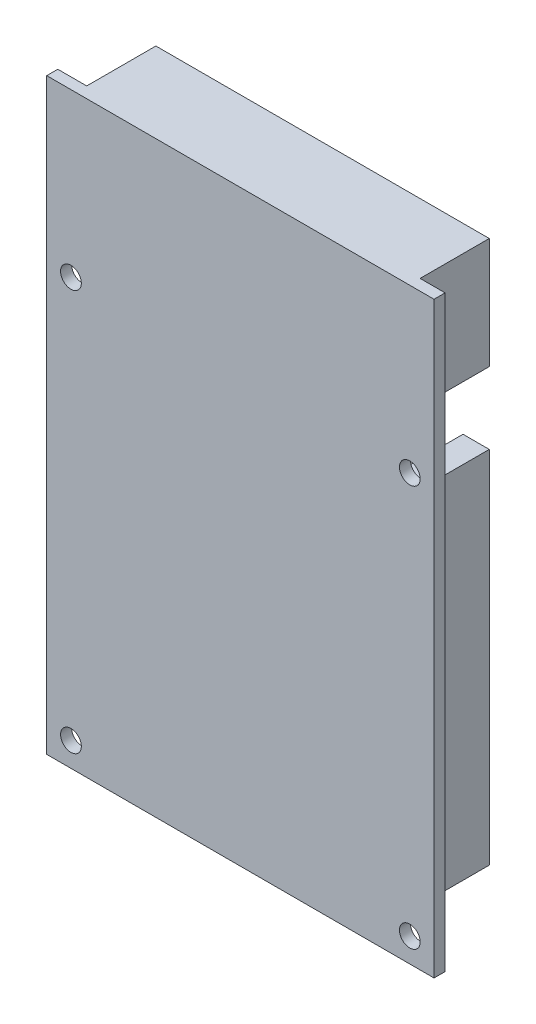
ISO-10303-21;
HEADER;
FILE_DESCRIPTION(('STEP AP214'),'2;1');
FILE_NAME('part.step','',(''),(''),'','','');
FILE_SCHEMA(('AUTOMOTIVE_DESIGN { 1 0 10303 214 1 1 1 1 }'));
ENDSEC;
DATA;
#1=APPLICATION_CONTEXT('core data for automotive mechanical design processes');
#2=APPLICATION_PROTOCOL_DEFINITION('international standard','automotive_design',2000,#1);
#3=PRODUCT_CONTEXT('',#1,'mechanical');
#4=PRODUCT('Part','Part','',(#3));
#5=PRODUCT_RELATED_PRODUCT_CATEGORY('part','',(#4));
#6=PRODUCT_DEFINITION_FORMATION('','',#4);
#7=PRODUCT_DEFINITION_CONTEXT('part definition',#1,'design');
#8=PRODUCT_DEFINITION('design','',#6,#7);
#9=PRODUCT_DEFINITION_SHAPE('','',#8);
#10=(LENGTH_UNIT() NAMED_UNIT(*) SI_UNIT(.MILLI.,.METRE.));
#11=(NAMED_UNIT(*) PLANE_ANGLE_UNIT() SI_UNIT($,.RADIAN.));
#12=(NAMED_UNIT(*) SI_UNIT($,.STERADIAN.) SOLID_ANGLE_UNIT());
#13=UNCERTAINTY_MEASURE_WITH_UNIT(LENGTH_MEASURE(1.E-05),#10,'distance_accuracy_value','');
#14=(GEOMETRIC_REPRESENTATION_CONTEXT(3) GLOBAL_UNCERTAINTY_ASSIGNED_CONTEXT((#13)) GLOBAL_UNIT_ASSIGNED_CONTEXT((#10,
#11,#12)) REPRESENTATION_CONTEXT('',''));
#15=CARTESIAN_POINT('',(0.,0.,0.));
#16=DIRECTION('',(0.,0.,1.));
#17=DIRECTION('',(1.,0.,0.));
#18=AXIS2_PLACEMENT_3D('',#15,#16,#17);
#19=CARTESIAN_POINT('',(0.,0.,0.));
#20=DIRECTION('',(0.,0.,1.));
#21=DIRECTION('',(1.,0.,0.));
#22=AXIS2_PLACEMENT_3D('',#19,#20,#21);
#23=PLANE('',#22);
#24=DIRECTION('',(0.,1.,0.));
#25=VECTOR('',#24,1.);
#26=CARTESIAN_POINT('',(-9.00506240899546,74.3864177164827,0.));
#27=LINE('',#26,#25);
#28=CARTESIAN_POINT('',(-9.00506240899546,58.3371568010973,0.));
#29=VERTEX_POINT('',#28);
#30=CARTESIAN_POINT('',(-9.00506240899546,74.3864177164827,0.));
#31=VERTEX_POINT('',#30);
#32=EDGE_CURVE('E147',#29,#31,#27,.T.);
#33=ORIENTED_EDGE('',*,*,#32,.F.);
#34=DIRECTION('',(-1.,0.,0.));
#35=VECTOR('',#34,1.);
#36=CARTESIAN_POINT('',(-9.00506240899546,58.3371568010973,0.));
#37=LINE('',#36,#35);
#38=CARTESIAN_POINT('',(39.2028995473623,58.3371568010973,0.));
#39=VERTEX_POINT('',#38);
#40=EDGE_CURVE('E160',#39,#29,#37,.T.);
#41=ORIENTED_EDGE('',*,*,#40,.F.);
#42=DIRECTION('',(0.,-1.,0.));
#43=VECTOR('',#42,1.);
#44=CARTESIAN_POINT('',(39.2028995473623,74.3864177164827,0.));
#45=LINE('',#44,#43);
#46=CARTESIAN_POINT('',(39.2028995473623,74.3864177164827,0.));
#47=VERTEX_POINT('',#46);
#48=EDGE_CURVE('E150',#47,#39,#45,.T.);
#49=ORIENTED_EDGE('',*,*,#48,.F.);
#50=DIRECTION('',(1.,0.,0.));
#51=VECTOR('',#50,1.);
#52=CARTESIAN_POINT('',(0.,74.3864177164827,0.));
#53=LINE('',#52,#51);
#54=CARTESIAN_POINT('',(42.816339796937,74.3864177164827,0.));
#55=VERTEX_POINT('',#54);
#56=EDGE_CURVE('E182',#47,#55,#53,.T.);
#57=ORIENTED_EDGE('',*,*,#56,.T.);
#58=DIRECTION('',(0.,-1.,0.));
#59=VECTOR('',#58,1.);
#60=CARTESIAN_POINT('',(42.816339796937,0.,0.));
#61=LINE('',#60,#59);
#62=CARTESIAN_POINT('',(42.816339796937,-10.6135822835173,0.));
#63=VERTEX_POINT('',#62);
#64=EDGE_CURVE('E214',#55,#63,#61,.T.);
#65=ORIENTED_EDGE('',*,*,#64,.T.);
#66=DIRECTION('',(1.,0.,0.));
#67=VECTOR('',#66,1.);
#68=CARTESIAN_POINT('',(0.,-10.6135822835173,0.));
#69=LINE('',#68,#67);
#70=CARTESIAN_POINT('',(-13.183660203063,-10.6135822835173,0.));
#71=VERTEX_POINT('',#70);
#72=EDGE_CURVE('E211',#71,#63,#69,.T.);
#73=ORIENTED_EDGE('',*,*,#72,.F.);
#74=DIRECTION('',(0.,-1.,0.));
#75=VECTOR('',#74,1.);
#76=CARTESIAN_POINT('',(-13.183660203063,0.,0.));
#77=LINE('',#76,#75);
#78=CARTESIAN_POINT('',(-13.183660203063,74.3864177164827,0.));
#79=VERTEX_POINT('',#78);
#80=EDGE_CURVE('E209',#79,#71,#77,.T.);
#81=ORIENTED_EDGE('',*,*,#80,.F.);
#82=EDGE_CURVE('E207',#79,#31,#53,.T.);
#83=ORIENTED_EDGE('',*,*,#82,.T.);
#84=EDGE_LOOP('',(#33,#41,#49,#57,#65,#73,#81,#83));
#85=FACE_BOUND('',#84,.T.);
#86=CARTESIAN_POINT('',(39.316339796937,-7.11358228351729,0.));
#87=DIRECTION('',(0.,0.,1.));
#88=DIRECTION('',(1.,0.,0.));
#89=AXIS2_PLACEMENT_3D('',#86,#87,#88);
#90=CIRCLE('',#89,1.5);
#91=CARTESIAN_POINT('',(40.816339796937,-7.11358228351729,0.));
#92=VERTEX_POINT('',#91);
#93=EDGE_CURVE('E217',#92,#92,#90,.T.);
#94=ORIENTED_EDGE('',*,*,#93,.T.);
#95=EDGE_LOOP('',(#94));
#96=FACE_BOUND('',#95,.T.);
#97=CARTESIAN_POINT('',(-9.68366020306298,-7.11358228351729,0.));
#98=DIRECTION('',(0.,0.,1.));
#99=DIRECTION('',(1.,0.,0.));
#100=AXIS2_PLACEMENT_3D('',#97,#98,#99);
#101=CIRCLE('',#100,1.5);
#102=CARTESIAN_POINT('',(-8.18366020306298,-7.11358228351729,0.));
#103=VERTEX_POINT('',#102);
#104=EDGE_CURVE('E220',#103,#103,#101,.T.);
#105=ORIENTED_EDGE('',*,*,#104,.T.);
#106=EDGE_LOOP('',(#105));
#107=FACE_BOUND('',#106,.T.);
#108=CARTESIAN_POINT('',(39.316339796937,50.8864177164827,0.));
#109=DIRECTION('',(0.,0.,1.));
#110=DIRECTION('',(1.,0.,0.));
#111=AXIS2_PLACEMENT_3D('',#108,#109,#110);
#112=CIRCLE('',#111,1.5);
#113=CARTESIAN_POINT('',(40.816339796937,50.8864177164827,0.));
#114=VERTEX_POINT('',#113);
#115=EDGE_CURVE('E223',#114,#114,#112,.T.);
#116=ORIENTED_EDGE('',*,*,#115,.T.);
#117=EDGE_LOOP('',(#116));
#118=FACE_BOUND('',#117,.T.);
#119=CARTESIAN_POINT('',(-9.68366020306298,50.8864177164827,0.));
#120=DIRECTION('',(0.,0.,1.));
#121=DIRECTION('',(1.,0.,0.));
#122=AXIS2_PLACEMENT_3D('',#119,#120,#121);
#123=CIRCLE('',#122,1.5);
#124=CARTESIAN_POINT('',(-8.18366020306298,50.8864177164827,0.));
#125=VERTEX_POINT('',#124);
#126=EDGE_CURVE('E187',#125,#125,#123,.T.);
#127=ORIENTED_EDGE('',*,*,#126,.T.);
#128=EDGE_LOOP('',(#127));
#129=FACE_BOUND('',#128,.T.);
#130=DIRECTION('',(0.,-1.,0.));
#131=VECTOR('',#130,1.);
#132=CARTESIAN_POINT('',(39.2028995473623,-4.09241826235331,0.));
#133=LINE('',#132,#131);
#134=CARTESIAN_POINT('',(39.2028995473623,47.9745151053931,0.));
#135=VERTEX_POINT('',#134);
#136=CARTESIAN_POINT('',(39.2028995473623,-4.09241826235331,0.));
#137=VERTEX_POINT('',#136);
#138=EDGE_CURVE('E146',#135,#137,#133,.T.);
#139=ORIENTED_EDGE('',*,*,#138,.F.);
#140=DIRECTION('',(1.,0.,0.));
#141=VECTOR('',#140,1.);
#142=CARTESIAN_POINT('',(39.2028995473623,47.9745151053931,0.));
#143=LINE('',#142,#141);
#144=CARTESIAN_POINT('',(35.4091044547423,47.9745151053931,0.));
#145=VERTEX_POINT('',#144);
#146=EDGE_CURVE('E143',#145,#135,#143,.T.);
#147=ORIENTED_EDGE('',*,*,#146,.F.);
#148=DIRECTION('',(0.,1.,0.));
#149=VECTOR('',#148,1.);
#150=CARTESIAN_POINT('',(35.4091044547423,-4.09241826235331,0.));
#151=LINE('',#150,#149);
#152=CARTESIAN_POINT('',(35.4091044547423,-4.09241826235331,0.));
#153=VERTEX_POINT('',#152);
#154=EDGE_CURVE('E58',#153,#145,#151,.T.);
#155=ORIENTED_EDGE('',*,*,#154,.F.);
#156=DIRECTION('',(-1.,0.,0.));
#157=VECTOR('',#156,1.);
#158=CARTESIAN_POINT('',(39.2028995473623,-4.09241826235331,0.));
#159=LINE('',#158,#157);
#160=EDGE_CURVE('E53',#137,#153,#159,.T.);
#161=ORIENTED_EDGE('',*,*,#160,.F.);
#162=EDGE_LOOP('',(#139,#147,#155,#161));
#163=FACE_BOUND('',#162,.T.);
#164=ADVANCED_FACE('F38',(#85,#96,#107,#118,#129,#163),#23,.F.);
#165=CARTESIAN_POINT('',(0.,74.3864177164827,1.6));
#166=DIRECTION('',(0.,1.,0.));
#167=DIRECTION('',(0.,0.,1.));
#168=AXIS2_PLACEMENT_3D('',#165,#166,#167);
#169=PLANE('',#168);
#170=ORIENTED_EDGE('',*,*,#82,.F.);
#171=DIRECTION('',(0.,0.,-1.));
#172=VECTOR('',#171,1.);
#173=CARTESIAN_POINT('',(-13.183660203063,74.3864177164827,1.6));
#174=LINE('',#173,#172);
#175=CARTESIAN_POINT('',(-13.183660203063,74.3864177164827,1.6));
#176=VERTEX_POINT('',#175);
#177=EDGE_CURVE('E11',#176,#79,#174,.T.);
#178=ORIENTED_EDGE('',*,*,#177,.F.);
#179=DIRECTION('',(1.,0.,0.));
#180=VECTOR('',#179,1.);
#181=CARTESIAN_POINT('',(0.,74.3864177164827,1.6));
#182=LINE('',#181,#180);
#183=CARTESIAN_POINT('',(42.816339796937,74.3864177164827,1.6));
#184=VERTEX_POINT('',#183);
#185=EDGE_CURVE('E183',#176,#184,#182,.T.);
#186=ORIENTED_EDGE('',*,*,#185,.T.);
#187=DIRECTION('',(0.,0.,-1.));
#188=VECTOR('',#187,1.);
#189=CARTESIAN_POINT('',(42.816339796937,74.3864177164827,1.6));
#190=LINE('',#189,#188);
#191=EDGE_CURVE('E206',#184,#55,#190,.T.);
#192=ORIENTED_EDGE('',*,*,#191,.T.);
#193=ORIENTED_EDGE('',*,*,#56,.F.);
#194=DIRECTION('',(0.,0.,1.));
#195=VECTOR('',#194,1.);
#196=CARTESIAN_POINT('',(39.2028995473623,74.3864177164827,-10.));
#197=LINE('',#196,#195);
#198=CARTESIAN_POINT('',(39.2028995473623,74.3864177164827,-10.));
#199=VERTEX_POINT('',#198);
#200=EDGE_CURVE('E176',#199,#47,#197,.T.);
#201=ORIENTED_EDGE('',*,*,#200,.F.);
#202=DIRECTION('',(1.,0.,0.));
#203=VECTOR('',#202,1.);
#204=CARTESIAN_POINT('',(-9.00506240899546,74.3864177164827,-10.));
#205=LINE('',#204,#203);
#206=CARTESIAN_POINT('',(-9.00506240899546,74.3864177164827,-10.));
#207=VERTEX_POINT('',#206);
#208=EDGE_CURVE('E159',#207,#199,#205,.T.);
#209=ORIENTED_EDGE('',*,*,#208,.F.);
#210=DIRECTION('',(0.,0.,1.));
#211=VECTOR('',#210,1.);
#212=CARTESIAN_POINT('',(-9.00506240899546,74.3864177164827,-10.));
#213=LINE('',#212,#211);
#214=EDGE_CURVE('E179',#207,#31,#213,.T.);
#215=ORIENTED_EDGE('',*,*,#214,.T.);
#216=EDGE_LOOP('',(#170,#178,#186,#192,#193,#201,#209,#215));
#217=FACE_BOUND('',#216,.T.);
#218=ADVANCED_FACE('F40',(#217),#169,.T.);
#219=CARTESIAN_POINT('',(-13.183660203063,0.,1.6));
#220=DIRECTION('',(1.,0.,0.));
#221=DIRECTION('',(0.,0.,-1.));
#222=AXIS2_PLACEMENT_3D('',#219,#220,#221);
#223=PLANE('',#222);
#224=ORIENTED_EDGE('',*,*,#80,.T.);
#225=DIRECTION('',(0.,0.,-1.));
#226=VECTOR('',#225,1.);
#227=CARTESIAN_POINT('',(-13.183660203063,-10.6135822835173,1.6));
#228=LINE('',#227,#226);
#229=CARTESIAN_POINT('',(-13.183660203063,-10.6135822835173,1.6));
#230=VERTEX_POINT('',#229);
#231=EDGE_CURVE('E46',#230,#71,#228,.T.);
#232=ORIENTED_EDGE('',*,*,#231,.F.);
#233=DIRECTION('',(0.,-1.,0.));
#234=VECTOR('',#233,1.);
#235=CARTESIAN_POINT('',(-13.183660203063,0.,1.6));
#236=LINE('',#235,#234);
#237=EDGE_CURVE('E186',#176,#230,#236,.T.);
#238=ORIENTED_EDGE('',*,*,#237,.F.);
#239=ORIENTED_EDGE('',*,*,#177,.T.);
#240=EDGE_LOOP('',(#224,#232,#238,#239));
#241=FACE_BOUND('',#240,.T.);
#242=ADVANCED_FACE('F253',(#241),#223,.F.);
#243=CARTESIAN_POINT('',(0.,-10.6135822835173,1.6));
#244=DIRECTION('',(0.,1.,0.));
#245=DIRECTION('',(0.,0.,1.));
#246=AXIS2_PLACEMENT_3D('',#243,#244,#245);
#247=PLANE('',#246);
#248=ORIENTED_EDGE('',*,*,#72,.T.);
#249=DIRECTION('',(0.,0.,-1.));
#250=VECTOR('',#249,1.);
#251=CARTESIAN_POINT('',(42.816339796937,-10.6135822835173,1.6));
#252=LINE('',#251,#250);
#253=CARTESIAN_POINT('',(42.816339796937,-10.6135822835173,1.6));
#254=VERTEX_POINT('',#253);
#255=EDGE_CURVE('E230',#254,#63,#252,.T.);
#256=ORIENTED_EDGE('',*,*,#255,.F.);
#257=DIRECTION('',(1.,0.,0.));
#258=VECTOR('',#257,1.);
#259=CARTESIAN_POINT('',(0.,-10.6135822835173,1.6));
#260=LINE('',#259,#258);
#261=EDGE_CURVE('E189',#230,#254,#260,.T.);
#262=ORIENTED_EDGE('',*,*,#261,.F.);
#263=ORIENTED_EDGE('',*,*,#231,.T.);
#264=EDGE_LOOP('',(#248,#256,#262,#263));
#265=FACE_BOUND('',#264,.T.);
#266=ADVANCED_FACE('F236',(#265),#247,.F.);
#267=CARTESIAN_POINT('',(39.316339796937,50.8864177164827,1.6));
#268=DIRECTION('',(0.,0.,-1.));
#269=DIRECTION('',(-1.,0.,0.));
#270=AXIS2_PLACEMENT_3D('',#267,#268,#269);
#271=CYLINDRICAL_SURFACE('',#270,1.5);
#272=CARTESIAN_POINT('',(39.316339796937,50.8864177164827,1.6));
#273=DIRECTION('',(0.,0.,1.));
#274=DIRECTION('',(1.,0.,0.));
#275=AXIS2_PLACEMENT_3D('',#272,#273,#274);
#276=CIRCLE('',#275,1.5);
#277=CARTESIAN_POINT('',(40.816339796937,50.8864177164827,1.6));
#278=VERTEX_POINT('',#277);
#279=EDGE_CURVE('E200',#278,#278,#276,.T.);
#280=ORIENTED_EDGE('',*,*,#279,.T.);
#281=EDGE_LOOP('',(#280));
#282=FACE_BOUND('',#281,.T.);
#283=ORIENTED_EDGE('',*,*,#115,.F.);
#284=EDGE_LOOP('',(#283));
#285=FACE_BOUND('',#284,.T.);
#286=ADVANCED_FACE('F289',(#282,#285),#271,.F.);
#287=CARTESIAN_POINT('',(-9.68366020306298,-7.11358228351729,1.6));
#288=DIRECTION('',(0.,0.,-1.));
#289=DIRECTION('',(-1.,0.,0.));
#290=AXIS2_PLACEMENT_3D('',#287,#288,#289);
#291=CYLINDRICAL_SURFACE('',#290,1.5);
#292=CARTESIAN_POINT('',(-9.68366020306298,-7.11358228351729,1.6));
#293=DIRECTION('',(0.,0.,1.));
#294=DIRECTION('',(1.,0.,0.));
#295=AXIS2_PLACEMENT_3D('',#292,#293,#294);
#296=CIRCLE('',#295,1.5);
#297=CARTESIAN_POINT('',(-8.18366020306298,-7.11358228351729,1.6));
#298=VERTEX_POINT('',#297);
#299=EDGE_CURVE('E197',#298,#298,#296,.T.);
#300=ORIENTED_EDGE('',*,*,#299,.T.);
#301=EDGE_LOOP('',(#300));
#302=FACE_BOUND('',#301,.T.);
#303=ORIENTED_EDGE('',*,*,#104,.F.);
#304=EDGE_LOOP('',(#303));
#305=FACE_BOUND('',#304,.T.);
#306=ADVANCED_FACE('F292',(#302,#305),#291,.F.);
#307=CARTESIAN_POINT('',(39.316339796937,-7.11358228351729,1.6));
#308=DIRECTION('',(0.,0.,-1.));
#309=DIRECTION('',(-1.,0.,0.));
#310=AXIS2_PLACEMENT_3D('',#307,#308,#309);
#311=CYLINDRICAL_SURFACE('',#310,1.5);
#312=CARTESIAN_POINT('',(39.316339796937,-7.11358228351729,1.6));
#313=DIRECTION('',(0.,0.,1.));
#314=DIRECTION('',(1.,0.,0.));
#315=AXIS2_PLACEMENT_3D('',#312,#313,#314);
#316=CIRCLE('',#315,1.5);
#317=CARTESIAN_POINT('',(40.816339796937,-7.11358228351729,1.6));
#318=VERTEX_POINT('',#317);
#319=EDGE_CURVE('E194',#318,#318,#316,.T.);
#320=ORIENTED_EDGE('',*,*,#319,.T.);
#321=EDGE_LOOP('',(#320));
#322=FACE_BOUND('',#321,.T.);
#323=ORIENTED_EDGE('',*,*,#93,.F.);
#324=EDGE_LOOP('',(#323));
#325=FACE_BOUND('',#324,.T.);
#326=ADVANCED_FACE('F296',(#322,#325),#311,.F.);
#327=CARTESIAN_POINT('',(42.816339796937,0.,1.6));
#328=DIRECTION('',(1.,0.,0.));
#329=DIRECTION('',(0.,1.,0.));
#330=AXIS2_PLACEMENT_3D('',#327,#328,#329);
#331=PLANE('',#330);
#332=ORIENTED_EDGE('',*,*,#64,.F.);
#333=ORIENTED_EDGE('',*,*,#191,.F.);
#334=DIRECTION('',(0.,-1.,0.));
#335=VECTOR('',#334,1.);
#336=CARTESIAN_POINT('',(42.816339796937,0.,1.6));
#337=LINE('',#336,#335);
#338=EDGE_CURVE('E191',#184,#254,#337,.T.);
#339=ORIENTED_EDGE('',*,*,#338,.T.);
#340=ORIENTED_EDGE('',*,*,#255,.T.);
#341=EDGE_LOOP('',(#332,#333,#339,#340));
#342=FACE_BOUND('',#341,.T.);
#343=ADVANCED_FACE('F247',(#342),#331,.T.);
#344=CARTESIAN_POINT('',(-9.68366020306298,50.8864177164827,1.6));
#345=DIRECTION('',(0.,0.,-1.));
#346=DIRECTION('',(-1.,0.,0.));
#347=AXIS2_PLACEMENT_3D('',#344,#345,#346);
#348=CYLINDRICAL_SURFACE('',#347,1.5);
#349=CARTESIAN_POINT('',(-9.68366020306298,50.8864177164827,1.6));
#350=DIRECTION('',(0.,0.,1.));
#351=DIRECTION('',(1.,0.,0.));
#352=AXIS2_PLACEMENT_3D('',#349,#350,#351);
#353=CIRCLE('',#352,1.5);
#354=CARTESIAN_POINT('',(-8.18366020306298,50.8864177164827,1.6));
#355=VERTEX_POINT('',#354);
#356=EDGE_CURVE('E203',#355,#355,#353,.T.);
#357=ORIENTED_EDGE('',*,*,#356,.T.);
#358=EDGE_LOOP('',(#357));
#359=FACE_BOUND('',#358,.T.);
#360=ORIENTED_EDGE('',*,*,#126,.F.);
#361=EDGE_LOOP('',(#360));
#362=FACE_BOUND('',#361,.T.);
#363=ADVANCED_FACE('F285',(#359,#362),#348,.F.);
#364=CARTESIAN_POINT('',(0.,0.,1.6));
#365=DIRECTION('',(0.,0.,1.));
#366=DIRECTION('',(1.,0.,0.));
#367=AXIS2_PLACEMENT_3D('',#364,#365,#366);
#368=PLANE('',#367);
#369=ORIENTED_EDGE('',*,*,#185,.F.);
#370=ORIENTED_EDGE('',*,*,#237,.T.);
#371=ORIENTED_EDGE('',*,*,#261,.T.);
#372=ORIENTED_EDGE('',*,*,#338,.F.);
#373=EDGE_LOOP('',(#369,#370,#371,#372));
#374=FACE_BOUND('',#373,.T.);
#375=ORIENTED_EDGE('',*,*,#319,.F.);
#376=EDGE_LOOP('',(#375));
#377=FACE_BOUND('',#376,.T.);
#378=ORIENTED_EDGE('',*,*,#299,.F.);
#379=EDGE_LOOP('',(#378));
#380=FACE_BOUND('',#379,.T.);
#381=ORIENTED_EDGE('',*,*,#279,.F.);
#382=EDGE_LOOP('',(#381));
#383=FACE_BOUND('',#382,.T.);
#384=ORIENTED_EDGE('',*,*,#356,.F.);
#385=EDGE_LOOP('',(#384));
#386=FACE_BOUND('',#385,.T.);
#387=ADVANCED_FACE('F251',(#374,#377,#380,#383,#386),#368,.T.);
#388=CARTESIAN_POINT('',(-9.00506240899546,74.3864177164827,-10.));
#389=DIRECTION('',(1.,0.,0.));
#390=DIRECTION('',(0.,0.,-1.));
#391=AXIS2_PLACEMENT_3D('',#388,#389,#390);
#392=PLANE('',#391);
#393=ORIENTED_EDGE('',*,*,#32,.T.);
#394=ORIENTED_EDGE('',*,*,#214,.F.);
#395=DIRECTION('',(0.,1.,0.));
#396=VECTOR('',#395,1.);
#397=CARTESIAN_POINT('',(-9.00506240899546,74.3864177164827,-10.));
#398=LINE('',#397,#396);
#399=CARTESIAN_POINT('',(-9.00506240899546,58.3371568010973,-10.));
#400=VERTEX_POINT('',#399);
#401=EDGE_CURVE('E156',#400,#207,#398,.T.);
#402=ORIENTED_EDGE('',*,*,#401,.F.);
#403=DIRECTION('',(0.,0.,1.));
#404=VECTOR('',#403,1.);
#405=CARTESIAN_POINT('',(-9.00506240899546,58.3371568010973,-10.));
#406=LINE('',#405,#404);
#407=EDGE_CURVE('E165',#400,#29,#406,.T.);
#408=ORIENTED_EDGE('',*,*,#407,.T.);
#409=EDGE_LOOP('',(#393,#394,#402,#408));
#410=FACE_BOUND('',#409,.T.);
#411=ADVANCED_FACE('F263',(#410),#392,.F.);
#412=CARTESIAN_POINT('',(39.2028995473623,74.3864177164827,-10.));
#413=DIRECTION('',(-1.,0.,0.));
#414=DIRECTION('',(0.,0.,1.));
#415=AXIS2_PLACEMENT_3D('',#412,#413,#414);
#416=PLANE('',#415);
#417=ORIENTED_EDGE('',*,*,#48,.T.);
#418=DIRECTION('',(0.,0.,1.));
#419=VECTOR('',#418,1.);
#420=CARTESIAN_POINT('',(39.2028995473623,58.3371568010973,-10.));
#421=LINE('',#420,#419);
#422=CARTESIAN_POINT('',(39.2028995473623,58.3371568010973,-10.));
#423=VERTEX_POINT('',#422);
#424=EDGE_CURVE('E173',#423,#39,#421,.T.);
#425=ORIENTED_EDGE('',*,*,#424,.F.);
#426=DIRECTION('',(0.,-1.,0.));
#427=VECTOR('',#426,1.);
#428=CARTESIAN_POINT('',(39.2028995473623,74.3864177164827,-10.));
#429=LINE('',#428,#427);
#430=EDGE_CURVE('E162',#199,#423,#429,.T.);
#431=ORIENTED_EDGE('',*,*,#430,.F.);
#432=ORIENTED_EDGE('',*,*,#200,.T.);
#433=EDGE_LOOP('',(#417,#425,#431,#432));
#434=FACE_BOUND('',#433,.T.);
#435=ADVANCED_FACE('F269',(#434),#416,.F.);
#436=CARTESIAN_POINT('',(-9.00506240899546,58.3371568010973,-10.));
#437=DIRECTION('',(0.,1.,0.));
#438=DIRECTION('',(0.,0.,1.));
#439=AXIS2_PLACEMENT_3D('',#436,#437,#438);
#440=PLANE('',#439);
#441=ORIENTED_EDGE('',*,*,#40,.T.);
#442=ORIENTED_EDGE('',*,*,#407,.F.);
#443=DIRECTION('',(-1.,0.,0.));
#444=VECTOR('',#443,1.);
#445=CARTESIAN_POINT('',(-9.00506240899546,58.3371568010973,-10.));
#446=LINE('',#445,#444);
#447=EDGE_CURVE('E164',#423,#400,#446,.T.);
#448=ORIENTED_EDGE('',*,*,#447,.F.);
#449=ORIENTED_EDGE('',*,*,#424,.T.);
#450=EDGE_LOOP('',(#441,#442,#448,#449));
#451=FACE_BOUND('',#450,.T.);
#452=ADVANCED_FACE('F259',(#451),#440,.F.);
#453=CARTESIAN_POINT('',(0.,0.,-10.));
#454=DIRECTION('',(0.,0.,1.));
#455=DIRECTION('',(1.,0.,0.));
#456=AXIS2_PLACEMENT_3D('',#453,#454,#455);
#457=PLANE('',#456);
#458=ORIENTED_EDGE('',*,*,#401,.T.);
#459=ORIENTED_EDGE('',*,*,#208,.T.);
#460=ORIENTED_EDGE('',*,*,#430,.T.);
#461=ORIENTED_EDGE('',*,*,#447,.T.);
#462=EDGE_LOOP('',(#458,#459,#460,#461));
#463=FACE_BOUND('',#462,.T.);
#464=ADVANCED_FACE('F265',(#463),#457,.F.);
#465=CARTESIAN_POINT('',(39.2028995473623,-4.09241826235331,-10.));
#466=DIRECTION('',(-1.,0.,0.));
#467=DIRECTION('',(0.,0.,1.));
#468=AXIS2_PLACEMENT_3D('',#465,#466,#467);
#469=PLANE('',#468);
#470=ORIENTED_EDGE('',*,*,#138,.T.);
#471=DIRECTION('',(0.,0.,1.));
#472=VECTOR('',#471,1.);
#473=CARTESIAN_POINT('',(39.2028995473623,-4.09241826235331,-10.));
#474=LINE('',#473,#472);
#475=CARTESIAN_POINT('',(39.2028995473623,-4.09241826235331,-10.));
#476=VERTEX_POINT('',#475);
#477=EDGE_CURVE('E127',#476,#137,#474,.T.);
#478=ORIENTED_EDGE('',*,*,#477,.F.);
#479=DIRECTION('',(0.,-1.,0.));
#480=VECTOR('',#479,1.);
#481=CARTESIAN_POINT('',(39.2028995473623,-4.09241826235331,-10.));
#482=LINE('',#481,#480);
#483=CARTESIAN_POINT('',(39.2028995473623,47.9745151053931,-10.));
#484=VERTEX_POINT('',#483);
#485=EDGE_CURVE('E134',#484,#476,#482,.T.);
#486=ORIENTED_EDGE('',*,*,#485,.F.);
#487=DIRECTION('',(0.,0.,1.));
#488=VECTOR('',#487,1.);
#489=CARTESIAN_POINT('',(39.2028995473623,47.9745151053931,-10.));
#490=LINE('',#489,#488);
#491=EDGE_CURVE('E475',#484,#135,#490,.T.);
#492=ORIENTED_EDGE('',*,*,#491,.T.);
#493=EDGE_LOOP('',(#470,#478,#486,#492));
#494=FACE_BOUND('',#493,.T.);
#495=ADVANCED_FACE('F145',(#494),#469,.F.);
#496=CARTESIAN_POINT('',(39.2028995473623,-4.09241826235331,-10.));
#497=DIRECTION('',(0.,1.,0.));
#498=DIRECTION('',(0.,0.,1.));
#499=AXIS2_PLACEMENT_3D('',#496,#497,#498);
#500=PLANE('',#499);
#501=ORIENTED_EDGE('',*,*,#160,.T.);
#502=DIRECTION('',(0.,0.,1.));
#503=VECTOR('',#502,1.);
#504=CARTESIAN_POINT('',(35.4091044547423,-4.09241826235331,-10.));
#505=LINE('',#504,#503);
#506=CARTESIAN_POINT('',(35.4091044547423,-4.09241826235331,-10.));
#507=VERTEX_POINT('',#506);
#508=EDGE_CURVE('E130',#507,#153,#505,.T.);
#509=ORIENTED_EDGE('',*,*,#508,.F.);
#510=DIRECTION('',(-1.,0.,0.));
#511=VECTOR('',#510,1.);
#512=CARTESIAN_POINT('',(39.2028995473623,-4.09241826235331,-10.));
#513=LINE('',#512,#511);
#514=EDGE_CURVE('E123',#476,#507,#513,.T.);
#515=ORIENTED_EDGE('',*,*,#514,.F.);
#516=ORIENTED_EDGE('',*,*,#477,.T.);
#517=EDGE_LOOP('',(#501,#509,#515,#516));
#518=FACE_BOUND('',#517,.T.);
#519=ADVANCED_FACE('F125',(#518),#500,.F.);
#520=CARTESIAN_POINT('',(35.4091044547423,-4.09241826235331,-10.));
#521=DIRECTION('',(1.,0.,0.));
#522=DIRECTION('',(0.,0.,-1.));
#523=AXIS2_PLACEMENT_3D('',#520,#521,#522);
#524=PLANE('',#523);
#525=ORIENTED_EDGE('',*,*,#154,.T.);
#526=DIRECTION('',(0.,0.,1.));
#527=VECTOR('',#526,1.);
#528=CARTESIAN_POINT('',(35.4091044547423,47.9745151053931,-10.));
#529=LINE('',#528,#527);
#530=CARTESIAN_POINT('',(35.4091044547423,47.9745151053931,-10.));
#531=VERTEX_POINT('',#530);
#532=EDGE_CURVE('E152',#531,#145,#529,.T.);
#533=ORIENTED_EDGE('',*,*,#532,.F.);
#534=DIRECTION('',(0.,1.,0.));
#535=VECTOR('',#534,1.);
#536=CARTESIAN_POINT('',(35.4091044547423,-4.09241826235331,-10.));
#537=LINE('',#536,#535);
#538=EDGE_CURVE('E133',#507,#531,#537,.T.);
#539=ORIENTED_EDGE('',*,*,#538,.F.);
#540=ORIENTED_EDGE('',*,*,#508,.T.);
#541=EDGE_LOOP('',(#525,#533,#539,#540));
#542=FACE_BOUND('',#541,.T.);
#543=ADVANCED_FACE('F378',(#542),#524,.F.);
#544=CARTESIAN_POINT('',(39.2028995473623,47.9745151053931,-10.));
#545=DIRECTION('',(0.,-1.,0.));
#546=DIRECTION('',(0.,0.,-1.));
#547=AXIS2_PLACEMENT_3D('',#544,#545,#546);
#548=PLANE('',#547);
#549=ORIENTED_EDGE('',*,*,#146,.T.);
#550=ORIENTED_EDGE('',*,*,#491,.F.);
#551=DIRECTION('',(1.,0.,0.));
#552=VECTOR('',#551,1.);
#553=CARTESIAN_POINT('',(39.2028995473623,47.9745151053931,-10.));
#554=LINE('',#553,#552);
#555=EDGE_CURVE('E139',#531,#484,#554,.T.);
#556=ORIENTED_EDGE('',*,*,#555,.F.);
#557=ORIENTED_EDGE('',*,*,#532,.T.);
#558=EDGE_LOOP('',(#549,#550,#556,#557));
#559=FACE_BOUND('',#558,.T.);
#560=ADVANCED_FACE('F387',(#559),#548,.F.);
#561=CARTESIAN_POINT('',(0.,0.,-10.));
#562=DIRECTION('',(0.,0.,1.));
#563=DIRECTION('',(1.,0.,0.));
#564=AXIS2_PLACEMENT_3D('',#561,#562,#563);
#565=PLANE('',#564);
#566=ORIENTED_EDGE('',*,*,#485,.T.);
#567=ORIENTED_EDGE('',*,*,#514,.T.);
#568=ORIENTED_EDGE('',*,*,#538,.T.);
#569=ORIENTED_EDGE('',*,*,#555,.T.);
#570=EDGE_LOOP('',(#566,#567,#568,#569));
#571=FACE_BOUND('',#570,.T.);
#572=ADVANCED_FACE('F137',(#571),#565,.F.);
#573=CLOSED_SHELL('',(#164,#218,#242,#266,#286,#306,#326,#343,#363,#387,#411,#435,#452,#464,
#495,#519,#543,#560,#572));
#574=MANIFOLD_SOLID_BREP('B2',#573);
#575=ADVANCED_BREP_SHAPE_REPRESENTATION('',(#18,#574),#14);
#576=SHAPE_DEFINITION_REPRESENTATION(#9,#575);
ENDSEC;
END-ISO-10303-21;
